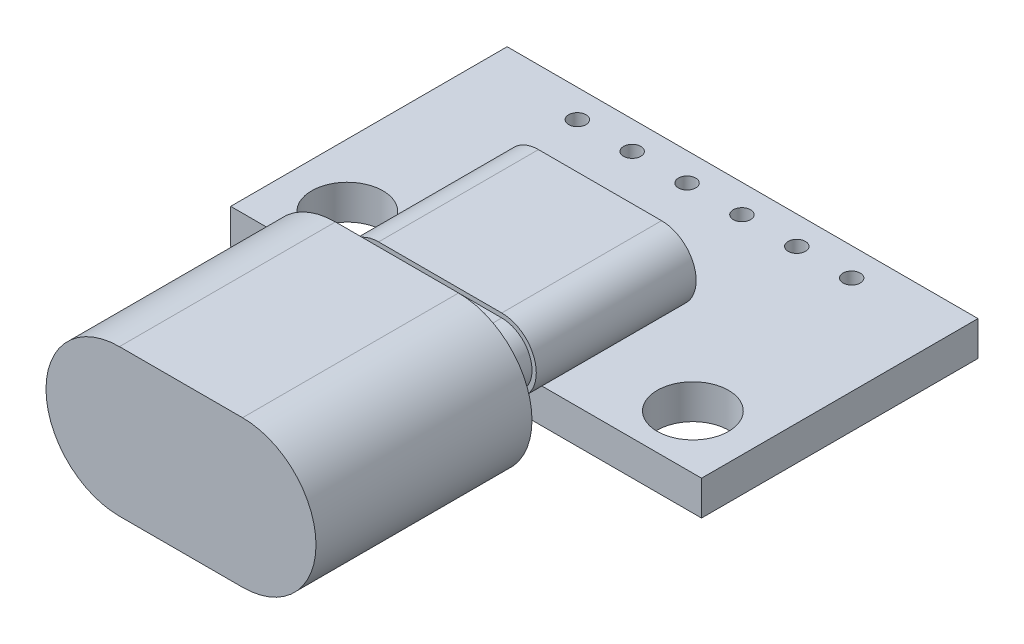
ISO-10303-21;
HEADER;
FILE_DESCRIPTION(('STEP AP214'),'2;1');
FILE_NAME('part.step','',(''),(''),'','','');
FILE_SCHEMA(('AUTOMOTIVE_DESIGN { 1 0 10303 214 1 1 1 1 }'));
ENDSEC;
DATA;
#1=APPLICATION_CONTEXT('core data for automotive mechanical design processes');
#2=APPLICATION_PROTOCOL_DEFINITION('international standard','automotive_design',2000,#1);
#3=PRODUCT_CONTEXT('',#1,'mechanical');
#4=PRODUCT('Part','Part','',(#3));
#5=PRODUCT_RELATED_PRODUCT_CATEGORY('part','',(#4));
#6=PRODUCT_DEFINITION_FORMATION('','',#4);
#7=PRODUCT_DEFINITION_CONTEXT('part definition',#1,'design');
#8=PRODUCT_DEFINITION('design','',#6,#7);
#9=PRODUCT_DEFINITION_SHAPE('','',#8);
#10=(LENGTH_UNIT() NAMED_UNIT(*) SI_UNIT(.MILLI.,.METRE.));
#11=(NAMED_UNIT(*) PLANE_ANGLE_UNIT() SI_UNIT($,.RADIAN.));
#12=(NAMED_UNIT(*) SI_UNIT($,.STERADIAN.) SOLID_ANGLE_UNIT());
#13=UNCERTAINTY_MEASURE_WITH_UNIT(LENGTH_MEASURE(1.E-05),#10,'distance_accuracy_value','');
#14=(GEOMETRIC_REPRESENTATION_CONTEXT(3) GLOBAL_UNCERTAINTY_ASSIGNED_CONTEXT((#13)) GLOBAL_UNIT_ASSIGNED_CONTEXT((#10,
#11,#12)) REPRESENTATION_CONTEXT('',''));
#15=CARTESIAN_POINT('',(0.,0.,0.));
#16=DIRECTION('',(0.,0.,1.));
#17=DIRECTION('',(1.,0.,0.));
#18=AXIS2_PLACEMENT_3D('',#15,#16,#17);
#19=CARTESIAN_POINT('',(-2.85,3.2,1.6));
#20=DIRECTION('',(0.,0.,1.));
#21=DIRECTION('',(1.,0.,0.));
#22=AXIS2_PLACEMENT_3D('',#19,#20,#21);
#23=PLANE('',#22);
#24=CARTESIAN_POINT('',(-2.85,3.2,1.6));
#25=DIRECTION('',(0.,0.,1.));
#26=DIRECTION('',(1.,0.,0.));
#27=AXIS2_PLACEMENT_3D('',#24,#25,#26);
#28=CIRCLE('',#27,1.3);
#29=CARTESIAN_POINT('',(-2.85,4.5,1.6));
#30=VERTEX_POINT('',#29);
#31=CARTESIAN_POINT('',(-2.85,1.9,1.6));
#32=VERTEX_POINT('',#31);
#33=EDGE_CURVE('E280',#30,#32,#28,.T.);
#34=ORIENTED_EDGE('',*,*,#33,.T.);
#35=DIRECTION('',(1.,0.,0.));
#36=VECTOR('',#35,1.);
#37=CARTESIAN_POINT('',(-2.85,1.9,1.6));
#38=LINE('',#37,#36);
#39=CARTESIAN_POINT('',(2.85,1.9,1.6));
#40=VERTEX_POINT('',#39);
#41=EDGE_CURVE('E278',#32,#40,#38,.T.);
#42=ORIENTED_EDGE('',*,*,#41,.T.);
#43=CARTESIAN_POINT('',(2.85,3.2,1.6));
#44=DIRECTION('',(0.,0.,1.));
#45=DIRECTION('',(1.,0.,0.));
#46=AXIS2_PLACEMENT_3D('',#43,#44,#45);
#47=CIRCLE('',#46,1.3);
#48=CARTESIAN_POINT('',(2.85,4.5,1.6));
#49=VERTEX_POINT('',#48);
#50=EDGE_CURVE('E283',#40,#49,#47,.T.);
#51=ORIENTED_EDGE('',*,*,#50,.T.);
#52=DIRECTION('',(-1.,0.,0.));
#53=VECTOR('',#52,1.);
#54=CARTESIAN_POINT('',(2.85,4.5,1.6));
#55=LINE('',#54,#53);
#56=EDGE_CURVE('E289',#49,#30,#55,.T.);
#57=ORIENTED_EDGE('',*,*,#56,.T.);
#58=EDGE_LOOP('',(#34,#42,#51,#57));
#59=FACE_BOUND('',#58,.T.);
#60=DIRECTION('',(-1.,0.,0.));
#61=VECTOR('',#60,1.);
#62=CARTESIAN_POINT('',(-2.9,3.55,1.6));
#63=LINE('',#62,#61);
#64=CARTESIAN_POINT('',(2.9,3.55,1.6));
#65=VERTEX_POINT('',#64);
#66=CARTESIAN_POINT('',(-2.9,3.55,1.6));
#67=VERTEX_POINT('',#66);
#68=EDGE_CURVE('E275',#65,#67,#63,.T.);
#69=ORIENTED_EDGE('',*,*,#68,.F.);
#70=DIRECTION('',(0.,1.,0.));
#71=VECTOR('',#70,1.);
#72=CARTESIAN_POINT('',(2.9,2.85,1.6));
#73=LINE('',#72,#71);
#74=CARTESIAN_POINT('',(2.9,2.85,1.6));
#75=VERTEX_POINT('',#74);
#76=EDGE_CURVE('E262',#75,#65,#73,.T.);
#77=ORIENTED_EDGE('',*,*,#76,.F.);
#78=DIRECTION('',(1.,0.,0.));
#79=VECTOR('',#78,1.);
#80=CARTESIAN_POINT('',(-2.9,2.85,1.6));
#81=LINE('',#80,#79);
#82=CARTESIAN_POINT('',(-2.9,2.85,1.6));
#83=VERTEX_POINT('',#82);
#84=EDGE_CURVE('E242',#83,#75,#81,.T.);
#85=ORIENTED_EDGE('',*,*,#84,.F.);
#86=DIRECTION('',(0.,-1.,0.));
#87=VECTOR('',#86,1.);
#88=CARTESIAN_POINT('',(-2.9,2.85,1.6));
#89=LINE('',#88,#87);
#90=EDGE_CURVE('E125',#67,#83,#89,.T.);
#91=ORIENTED_EDGE('',*,*,#90,.F.);
#92=EDGE_LOOP('',(#69,#77,#85,#91));
#93=FACE_BOUND('',#92,.T.);
#94=ADVANCED_FACE('F110',(#59,#93),#23,.T.);
#95=CARTESIAN_POINT('',(-2.85,1.6,7.6));
#96=DIRECTION('',(0.,0.,1.));
#97=DIRECTION('',(1.,0.,0.));
#98=AXIS2_PLACEMENT_3D('',#95,#96,#97);
#99=PLANE('',#98);
#100=CARTESIAN_POINT('',(-2.85,3.2,7.6));
#101=DIRECTION('',(0.,0.,1.));
#102=DIRECTION('',(1.,0.,0.));
#103=AXIS2_PLACEMENT_3D('',#100,#101,#102);
#104=CIRCLE('',#103,1.3);
#105=CARTESIAN_POINT('',(-2.85,4.5,7.6));
#106=VERTEX_POINT('',#105);
#107=CARTESIAN_POINT('',(-2.85,1.9,7.6));
#108=VERTEX_POINT('',#107);
#109=EDGE_CURVE('E135',#106,#108,#104,.T.);
#110=ORIENTED_EDGE('',*,*,#109,.F.);
#111=DIRECTION('',(-1.,0.,0.));
#112=VECTOR('',#111,1.);
#113=CARTESIAN_POINT('',(2.85,4.5,7.6));
#114=LINE('',#113,#112);
#115=CARTESIAN_POINT('',(2.85,4.5,7.6));
#116=VERTEX_POINT('',#115);
#117=EDGE_CURVE('E281',#116,#106,#114,.T.);
#118=ORIENTED_EDGE('',*,*,#117,.F.);
#119=CARTESIAN_POINT('',(2.85,3.2,7.6));
#120=DIRECTION('',(0.,0.,1.));
#121=DIRECTION('',(1.,0.,0.));
#122=AXIS2_PLACEMENT_3D('',#119,#120,#121);
#123=CIRCLE('',#122,1.3);
#124=CARTESIAN_POINT('',(2.85,1.9,7.6));
#125=VERTEX_POINT('',#124);
#126=EDGE_CURVE('E294',#125,#116,#123,.T.);
#127=ORIENTED_EDGE('',*,*,#126,.F.);
#128=DIRECTION('',(1.,0.,0.));
#129=VECTOR('',#128,1.);
#130=CARTESIAN_POINT('',(-2.85,1.9,7.6));
#131=LINE('',#130,#129);
#132=EDGE_CURVE('E259',#108,#125,#131,.T.);
#133=ORIENTED_EDGE('',*,*,#132,.F.);
#134=EDGE_LOOP('',(#110,#118,#127,#133));
#135=FACE_BOUND('',#134,.T.);
#136=CARTESIAN_POINT('',(-2.85,3.2,7.6));
#137=DIRECTION('',(0.,0.,1.));
#138=DIRECTION('',(1.,0.,0.));
#139=AXIS2_PLACEMENT_3D('',#136,#137,#138);
#140=CIRCLE('',#139,1.6);
#141=CARTESIAN_POINT('',(-2.85,4.8,7.6));
#142=VERTEX_POINT('',#141);
#143=CARTESIAN_POINT('',(-2.85,1.6,7.6));
#144=VERTEX_POINT('',#143);
#145=EDGE_CURVE('E14',#142,#144,#140,.T.);
#146=ORIENTED_EDGE('',*,*,#145,.T.);
#147=DIRECTION('',(1.,0.,0.));
#148=VECTOR('',#147,1.);
#149=CARTESIAN_POINT('',(-2.85,1.6,7.6));
#150=LINE('',#149,#148);
#151=CARTESIAN_POINT('',(2.85,1.6,7.6));
#152=VERTEX_POINT('',#151);
#153=EDGE_CURVE('E116',#144,#152,#150,.T.);
#154=ORIENTED_EDGE('',*,*,#153,.T.);
#155=CARTESIAN_POINT('',(2.85,3.2,7.6));
#156=DIRECTION('',(0.,0.,1.));
#157=DIRECTION('',(1.,0.,0.));
#158=AXIS2_PLACEMENT_3D('',#155,#156,#157);
#159=CIRCLE('',#158,1.6);
#160=CARTESIAN_POINT('',(2.85,4.8,7.6));
#161=VERTEX_POINT('',#160);
#162=EDGE_CURVE('E381',#152,#161,#159,.T.);
#163=ORIENTED_EDGE('',*,*,#162,.T.);
#164=DIRECTION('',(-1.,0.,0.));
#165=VECTOR('',#164,1.);
#166=CARTESIAN_POINT('',(-2.85,4.8,7.6));
#167=LINE('',#166,#165);
#168=EDGE_CURVE('E378',#161,#142,#167,.T.);
#169=ORIENTED_EDGE('',*,*,#168,.T.);
#170=EDGE_LOOP('',(#146,#154,#163,#169));
#171=FACE_BOUND('',#170,.T.);
#172=ADVANCED_FACE('F108',(#135,#171),#99,.T.);
#173=CARTESIAN_POINT('',(0.,1.6,0.));
#174=DIRECTION('',(0.,-1.,0.));
#175=DIRECTION('',(0.,0.,-1.));
#176=AXIS2_PLACEMENT_3D('',#173,#174,#175);
#177=PLANE('',#176);
#178=CARTESIAN_POINT('',(6.35,1.6,-5.1));
#179=DIRECTION('',(0.,1.,0.));
#180=DIRECTION('',(0.,0.,-1.));
#181=AXIS2_PLACEMENT_3D('',#178,#179,#180);
#182=CIRCLE('',#181,0.4);
#183=CARTESIAN_POINT('',(6.35,1.6,-5.5));
#184=VERTEX_POINT('',#183);
#185=EDGE_CURVE('E747',#184,#184,#182,.T.);
#186=ORIENTED_EDGE('',*,*,#185,.F.);
#187=EDGE_LOOP('',(#186));
#188=FACE_BOUND('',#187,.T.);
#189=CARTESIAN_POINT('',(3.81,1.6,-5.1));
#190=DIRECTION('',(0.,1.,0.));
#191=DIRECTION('',(0.,0.,-1.));
#192=AXIS2_PLACEMENT_3D('',#189,#190,#191);
#193=CIRCLE('',#192,0.4);
#194=CARTESIAN_POINT('',(3.81,1.6,-5.5));
#195=VERTEX_POINT('',#194);
#196=EDGE_CURVE('E741',#195,#195,#193,.T.);
#197=ORIENTED_EDGE('',*,*,#196,.F.);
#198=EDGE_LOOP('',(#197));
#199=FACE_BOUND('',#198,.T.);
#200=CARTESIAN_POINT('',(1.27,1.6,-5.1));
#201=DIRECTION('',(0.,1.,0.));
#202=DIRECTION('',(0.,0.,-1.));
#203=AXIS2_PLACEMENT_3D('',#200,#201,#202);
#204=CIRCLE('',#203,0.4);
#205=CARTESIAN_POINT('',(1.27,1.6,-5.5));
#206=VERTEX_POINT('',#205);
#207=EDGE_CURVE('E748',#206,#206,#204,.T.);
#208=ORIENTED_EDGE('',*,*,#207,.F.);
#209=EDGE_LOOP('',(#208));
#210=FACE_BOUND('',#209,.T.);
#211=CARTESIAN_POINT('',(-6.35,1.6,-5.1));
#212=DIRECTION('',(0.,1.,0.));
#213=DIRECTION('',(0.,0.,1.));
#214=AXIS2_PLACEMENT_3D('',#211,#212,#213);
#215=CIRCLE('',#214,0.4);
#216=CARTESIAN_POINT('',(-6.35,1.6,-4.7));
#217=VERTEX_POINT('',#216);
#218=EDGE_CURVE('E753',#217,#217,#215,.T.);
#219=ORIENTED_EDGE('',*,*,#218,.F.);
#220=EDGE_LOOP('',(#219));
#221=FACE_BOUND('',#220,.T.);
#222=CARTESIAN_POINT('',(-3.81,1.6,-5.1));
#223=DIRECTION('',(0.,1.,0.));
#224=DIRECTION('',(0.,0.,1.));
#225=AXIS2_PLACEMENT_3D('',#222,#223,#224);
#226=CIRCLE('',#225,0.4);
#227=CARTESIAN_POINT('',(-3.81,1.6,-4.7));
#228=VERTEX_POINT('',#227);
#229=EDGE_CURVE('E759',#228,#228,#226,.T.);
#230=ORIENTED_EDGE('',*,*,#229,.F.);
#231=EDGE_LOOP('',(#230));
#232=FACE_BOUND('',#231,.T.);
#233=CARTESIAN_POINT('',(-1.27,1.6,-5.1));
#234=DIRECTION('',(0.,1.,0.));
#235=DIRECTION('',(0.,0.,1.));
#236=AXIS2_PLACEMENT_3D('',#233,#234,#235);
#237=CIRCLE('',#236,0.4);
#238=CARTESIAN_POINT('',(-1.27,1.6,-4.7));
#239=VERTEX_POINT('',#238);
#240=EDGE_CURVE('E404',#239,#239,#237,.T.);
#241=ORIENTED_EDGE('',*,*,#240,.F.);
#242=EDGE_LOOP('',(#241));
#243=FACE_BOUND('',#242,.T.);
#244=CARTESIAN_POINT('',(8.,1.6,3.9));
#245=DIRECTION('',(0.,1.,0.));
#246=DIRECTION('',(0.,0.,1.));
#247=AXIS2_PLACEMENT_3D('',#244,#245,#246);
#248=CIRCLE('',#247,1.65);
#249=CARTESIAN_POINT('',(8.,1.6,5.55));
#250=VERTEX_POINT('',#249);
#251=EDGE_CURVE('E355',#250,#250,#248,.T.);
#252=ORIENTED_EDGE('',*,*,#251,.F.);
#253=EDGE_LOOP('',(#252));
#254=FACE_BOUND('',#253,.T.);
#255=CARTESIAN_POINT('',(-8.,1.6,3.9));
#256=DIRECTION('',(0.,1.,0.));
#257=DIRECTION('',(0.,0.,1.));
#258=AXIS2_PLACEMENT_3D('',#255,#256,#257);
#259=CIRCLE('',#258,1.65);
#260=CARTESIAN_POINT('',(-8.,1.6,5.55));
#261=VERTEX_POINT('',#260);
#262=EDGE_CURVE('E360',#261,#261,#259,.T.);
#263=ORIENTED_EDGE('',*,*,#262,.F.);
#264=EDGE_LOOP('',(#263));
#265=FACE_BOUND('',#264,.T.);
#266=DIRECTION('',(0.,0.,1.));
#267=VECTOR('',#266,1.);
#268=CARTESIAN_POINT('',(-2.85,1.6,0.2));
#269=LINE('',#268,#267);
#270=CARTESIAN_POINT('',(-2.85,1.6,0.2));
#271=VERTEX_POINT('',#270);
#272=CARTESIAN_POINT('',(-2.85,1.6,6.4));
#273=VERTEX_POINT('',#272);
#274=EDGE_CURVE('E368',#271,#273,#269,.T.);
#275=ORIENTED_EDGE('',*,*,#274,.F.);
#276=DIRECTION('',(1.,0.,0.));
#277=VECTOR('',#276,1.);
#278=CARTESIAN_POINT('',(-2.85,1.6,0.2));
#279=LINE('',#278,#277);
#280=CARTESIAN_POINT('',(2.85,1.6,0.2));
#281=VERTEX_POINT('',#280);
#282=EDGE_CURVE('E394',#271,#281,#279,.T.);
#283=ORIENTED_EDGE('',*,*,#282,.T.);
#284=DIRECTION('',(0.,0.,1.));
#285=VECTOR('',#284,1.);
#286=CARTESIAN_POINT('',(2.85,1.6,0.2));
#287=LINE('',#286,#285);
#288=CARTESIAN_POINT('',(2.85,1.6,6.4));
#289=VERTEX_POINT('',#288);
#290=EDGE_CURVE('E371',#281,#289,#287,.T.);
#291=ORIENTED_EDGE('',*,*,#290,.T.);
#292=DIRECTION('',(1.,0.,0.));
#293=VECTOR('',#292,1.);
#294=CARTESIAN_POINT('',(-10.9,1.6,6.4));
#295=LINE('',#294,#293);
#296=CARTESIAN_POINT('',(10.9,1.6,6.4));
#297=VERTEX_POINT('',#296);
#298=EDGE_CURVE('E344',#289,#297,#295,.T.);
#299=ORIENTED_EDGE('',*,*,#298,.T.);
#300=DIRECTION('',(0.,0.,-1.));
#301=VECTOR('',#300,1.);
#302=CARTESIAN_POINT('',(10.9,1.6,6.4));
#303=LINE('',#302,#301);
#304=CARTESIAN_POINT('',(10.9,1.6,-6.4));
#305=VERTEX_POINT('',#304);
#306=EDGE_CURVE('E327',#297,#305,#303,.T.);
#307=ORIENTED_EDGE('',*,*,#306,.T.);
#308=DIRECTION('',(-1.,0.,0.));
#309=VECTOR('',#308,1.);
#310=CARTESIAN_POINT('',(-10.9,1.6,-6.4));
#311=LINE('',#310,#309);
#312=CARTESIAN_POINT('',(-10.9,1.6,-6.4));
#313=VERTEX_POINT('',#312);
#314=EDGE_CURVE('E347',#305,#313,#311,.T.);
#315=ORIENTED_EDGE('',*,*,#314,.T.);
#316=DIRECTION('',(0.,0.,1.));
#317=VECTOR('',#316,1.);
#318=CARTESIAN_POINT('',(-10.9,1.6,6.4));
#319=LINE('',#318,#317);
#320=CARTESIAN_POINT('',(-10.9,1.6,6.4));
#321=VERTEX_POINT('',#320);
#322=EDGE_CURVE('E342',#313,#321,#319,.T.);
#323=ORIENTED_EDGE('',*,*,#322,.T.);
#324=EDGE_CURVE('E323',#321,#273,#295,.T.);
#325=ORIENTED_EDGE('',*,*,#324,.T.);
#326=EDGE_LOOP('',(#275,#283,#291,#299,#307,#315,#323,#325));
#327=FACE_BOUND('',#326,.T.);
#328=ADVANCED_FACE('F468',(#188,#199,#210,#221,#232,#243,#254,#265,#327),#177,.F.);
#329=CARTESIAN_POINT('',(10.9,1.6,6.4));
#330=DIRECTION('',(-1.,0.,0.));
#331=DIRECTION('',(0.,0.,1.));
#332=AXIS2_PLACEMENT_3D('',#329,#330,#331);
#333=PLANE('',#332);
#334=DIRECTION('',(0.,0.,-1.));
#335=VECTOR('',#334,1.);
#336=CARTESIAN_POINT('',(10.9,0.,6.4));
#337=LINE('',#336,#335);
#338=CARTESIAN_POINT('',(10.9,0.,6.4));
#339=VERTEX_POINT('',#338);
#340=CARTESIAN_POINT('',(10.9,0.,-6.4));
#341=VERTEX_POINT('',#340);
#342=EDGE_CURVE('E331',#339,#341,#337,.T.);
#343=ORIENTED_EDGE('',*,*,#342,.T.);
#344=DIRECTION('',(0.,-1.,0.));
#345=VECTOR('',#344,1.);
#346=CARTESIAN_POINT('',(10.9,1.6,-6.4));
#347=LINE('',#346,#345);
#348=EDGE_CURVE('E304',#305,#341,#347,.T.);
#349=ORIENTED_EDGE('',*,*,#348,.F.);
#350=ORIENTED_EDGE('',*,*,#306,.F.);
#351=DIRECTION('',(0.,-1.,0.));
#352=VECTOR('',#351,1.);
#353=CARTESIAN_POINT('',(10.9,1.6,6.4));
#354=LINE('',#353,#352);
#355=EDGE_CURVE('E319',#297,#339,#354,.T.);
#356=ORIENTED_EDGE('',*,*,#355,.T.);
#357=EDGE_LOOP('',(#343,#349,#350,#356));
#358=FACE_BOUND('',#357,.T.);
#359=ADVANCED_FACE('F453',(#358),#333,.F.);
#360=CARTESIAN_POINT('',(-10.9,1.6,-6.4));
#361=DIRECTION('',(0.,0.,1.));
#362=DIRECTION('',(1.,0.,0.));
#363=AXIS2_PLACEMENT_3D('',#360,#361,#362);
#364=PLANE('',#363);
#365=DIRECTION('',(-1.,0.,0.));
#366=VECTOR('',#365,1.);
#367=CARTESIAN_POINT('',(-10.9,0.,-6.4));
#368=LINE('',#367,#366);
#369=CARTESIAN_POINT('',(-10.9,0.,-6.4));
#370=VERTEX_POINT('',#369);
#371=EDGE_CURVE('E332',#341,#370,#368,.T.);
#372=ORIENTED_EDGE('',*,*,#371,.T.);
#373=DIRECTION('',(0.,-1.,0.));
#374=VECTOR('',#373,1.);
#375=CARTESIAN_POINT('',(-10.9,1.6,-6.4));
#376=LINE('',#375,#374);
#377=EDGE_CURVE('E311',#313,#370,#376,.T.);
#378=ORIENTED_EDGE('',*,*,#377,.F.);
#379=ORIENTED_EDGE('',*,*,#314,.F.);
#380=ORIENTED_EDGE('',*,*,#348,.T.);
#381=EDGE_LOOP('',(#372,#378,#379,#380));
#382=FACE_BOUND('',#381,.T.);
#383=ADVANCED_FACE('F463',(#382),#364,.F.);
#384=CARTESIAN_POINT('',(-10.9,1.6,6.4));
#385=DIRECTION('',(1.,0.,0.));
#386=DIRECTION('',(0.,0.,-1.));
#387=AXIS2_PLACEMENT_3D('',#384,#385,#386);
#388=PLANE('',#387);
#389=DIRECTION('',(0.,0.,1.));
#390=VECTOR('',#389,1.);
#391=CARTESIAN_POINT('',(-10.9,0.,6.4));
#392=LINE('',#391,#390);
#393=CARTESIAN_POINT('',(-10.9,0.,6.4));
#394=VERTEX_POINT('',#393);
#395=EDGE_CURVE('E330',#370,#394,#392,.T.);
#396=ORIENTED_EDGE('',*,*,#395,.T.);
#397=DIRECTION('',(0.,-1.,0.));
#398=VECTOR('',#397,1.);
#399=CARTESIAN_POINT('',(-10.9,1.6,6.4));
#400=LINE('',#399,#398);
#401=EDGE_CURVE('E320',#321,#394,#400,.T.);
#402=ORIENTED_EDGE('',*,*,#401,.F.);
#403=ORIENTED_EDGE('',*,*,#322,.F.);
#404=ORIENTED_EDGE('',*,*,#377,.T.);
#405=EDGE_LOOP('',(#396,#402,#403,#404));
#406=FACE_BOUND('',#405,.T.);
#407=ADVANCED_FACE('F461',(#406),#388,.F.);
#408=CARTESIAN_POINT('',(-10.9,1.6,6.4));
#409=DIRECTION('',(0.,0.,-1.));
#410=DIRECTION('',(-1.,0.,0.));
#411=AXIS2_PLACEMENT_3D('',#408,#409,#410);
#412=PLANE('',#411);
#413=DIRECTION('',(1.,0.,0.));
#414=VECTOR('',#413,1.);
#415=CARTESIAN_POINT('',(-10.9,0.,6.4));
#416=LINE('',#415,#414);
#417=EDGE_CURVE('E322',#394,#339,#416,.T.);
#418=ORIENTED_EDGE('',*,*,#417,.T.);
#419=ORIENTED_EDGE('',*,*,#355,.F.);
#420=ORIENTED_EDGE('',*,*,#298,.F.);
#421=EDGE_CURVE('E343',#273,#289,#295,.T.);
#422=ORIENTED_EDGE('',*,*,#421,.F.);
#423=ORIENTED_EDGE('',*,*,#324,.F.);
#424=ORIENTED_EDGE('',*,*,#401,.T.);
#425=EDGE_LOOP('',(#418,#419,#420,#422,#423,#424));
#426=FACE_BOUND('',#425,.T.);
#427=ADVANCED_FACE('F431',(#426),#412,.F.);
#428=CARTESIAN_POINT('',(0.,0.,0.));
#429=DIRECTION('',(0.,-1.,0.));
#430=DIRECTION('',(0.,0.,-1.));
#431=AXIS2_PLACEMENT_3D('',#428,#429,#430);
#432=PLANE('',#431);
#433=CARTESIAN_POINT('',(6.35,0.,-5.1));
#434=DIRECTION('',(0.,-1.,0.));
#435=DIRECTION('',(0.,0.,-1.));
#436=AXIS2_PLACEMENT_3D('',#433,#434,#435);
#437=CIRCLE('',#436,0.4);
#438=CARTESIAN_POINT('',(6.35,0.,-5.5));
#439=VERTEX_POINT('',#438);
#440=EDGE_CURVE('E112',#439,#439,#437,.T.);
#441=ORIENTED_EDGE('',*,*,#440,.F.);
#442=EDGE_LOOP('',(#441));
#443=FACE_BOUND('',#442,.T.);
#444=CARTESIAN_POINT('',(3.81,0.,-5.1));
#445=DIRECTION('',(0.,-1.,0.));
#446=DIRECTION('',(0.,0.,-1.));
#447=AXIS2_PLACEMENT_3D('',#444,#445,#446);
#448=CIRCLE('',#447,0.4);
#449=CARTESIAN_POINT('',(3.81,0.,-5.5));
#450=VERTEX_POINT('',#449);
#451=EDGE_CURVE('E412',#450,#450,#448,.T.);
#452=ORIENTED_EDGE('',*,*,#451,.F.);
#453=EDGE_LOOP('',(#452));
#454=FACE_BOUND('',#453,.T.);
#455=CARTESIAN_POINT('',(1.27,0.,-5.1));
#456=DIRECTION('',(0.,-1.,0.));
#457=DIRECTION('',(0.,0.,-1.));
#458=AXIS2_PLACEMENT_3D('',#455,#456,#457);
#459=CIRCLE('',#458,0.4);
#460=CARTESIAN_POINT('',(1.27,0.,-5.5));
#461=VERTEX_POINT('',#460);
#462=EDGE_CURVE('E409',#461,#461,#459,.T.);
#463=ORIENTED_EDGE('',*,*,#462,.F.);
#464=EDGE_LOOP('',(#463));
#465=FACE_BOUND('',#464,.T.);
#466=CARTESIAN_POINT('',(-6.35,0.,-5.1));
#467=DIRECTION('',(0.,-1.,0.));
#468=DIRECTION('',(0.,0.,-1.));
#469=AXIS2_PLACEMENT_3D('',#466,#467,#468);
#470=CIRCLE('',#469,0.4);
#471=CARTESIAN_POINT('',(-6.35,0.,-5.5));
#472=VERTEX_POINT('',#471);
#473=EDGE_CURVE('E410',#472,#472,#470,.T.);
#474=ORIENTED_EDGE('',*,*,#473,.F.);
#475=EDGE_LOOP('',(#474));
#476=FACE_BOUND('',#475,.T.);
#477=CARTESIAN_POINT('',(-3.81,0.,-5.1));
#478=DIRECTION('',(0.,-1.,0.));
#479=DIRECTION('',(0.,0.,-1.));
#480=AXIS2_PLACEMENT_3D('',#477,#478,#479);
#481=CIRCLE('',#480,0.4);
#482=CARTESIAN_POINT('',(-3.81,0.,-5.5));
#483=VERTEX_POINT('',#482);
#484=EDGE_CURVE('E401',#483,#483,#481,.T.);
#485=ORIENTED_EDGE('',*,*,#484,.F.);
#486=EDGE_LOOP('',(#485));
#487=FACE_BOUND('',#486,.T.);
#488=CARTESIAN_POINT('',(-1.27,0.,-5.1));
#489=DIRECTION('',(0.,-1.,0.));
#490=DIRECTION('',(0.,0.,-1.));
#491=AXIS2_PLACEMENT_3D('',#488,#489,#490);
#492=CIRCLE('',#491,0.4);
#493=CARTESIAN_POINT('',(-1.27,0.,-5.5));
#494=VERTEX_POINT('',#493);
#495=EDGE_CURVE('E400',#494,#494,#492,.T.);
#496=ORIENTED_EDGE('',*,*,#495,.F.);
#497=EDGE_LOOP('',(#496));
#498=FACE_BOUND('',#497,.T.);
#499=CARTESIAN_POINT('',(-8.,0.,3.9));
#500=DIRECTION('',(0.,1.,0.));
#501=DIRECTION('',(0.,0.,1.));
#502=AXIS2_PLACEMENT_3D('',#499,#500,#501);
#503=CIRCLE('',#502,1.65);
#504=CARTESIAN_POINT('',(-8.,0.,5.55));
#505=VERTEX_POINT('',#504);
#506=EDGE_CURVE('E337',#505,#505,#503,.T.);
#507=ORIENTED_EDGE('',*,*,#506,.T.);
#508=EDGE_LOOP('',(#507));
#509=FACE_BOUND('',#508,.T.);
#510=CARTESIAN_POINT('',(8.,0.,3.9));
#511=DIRECTION('',(0.,1.,0.));
#512=DIRECTION('',(0.,0.,1.));
#513=AXIS2_PLACEMENT_3D('',#510,#511,#512);
#514=CIRCLE('',#513,1.65);
#515=CARTESIAN_POINT('',(8.,0.,5.55));
#516=VERTEX_POINT('',#515);
#517=EDGE_CURVE('E358',#516,#516,#514,.T.);
#518=ORIENTED_EDGE('',*,*,#517,.T.);
#519=EDGE_LOOP('',(#518));
#520=FACE_BOUND('',#519,.T.);
#521=ORIENTED_EDGE('',*,*,#342,.F.);
#522=ORIENTED_EDGE('',*,*,#417,.F.);
#523=ORIENTED_EDGE('',*,*,#395,.F.);
#524=ORIENTED_EDGE('',*,*,#371,.F.);
#525=EDGE_LOOP('',(#521,#522,#523,#524));
#526=FACE_BOUND('',#525,.T.);
#527=ADVANCED_FACE('F430',(#443,#454,#465,#476,#487,#498,#509,#520,#526),#432,.T.);
#528=CARTESIAN_POINT('',(8.,0.,3.9));
#529=DIRECTION('',(0.,1.,0.));
#530=DIRECTION('',(0.,0.,1.));
#531=AXIS2_PLACEMENT_3D('',#528,#529,#530);
#532=CYLINDRICAL_SURFACE('',#531,1.65);
#533=ORIENTED_EDGE('',*,*,#517,.F.);
#534=EDGE_LOOP('',(#533));
#535=FACE_BOUND('',#534,.T.);
#536=ORIENTED_EDGE('',*,*,#251,.T.);
#537=EDGE_LOOP('',(#536));
#538=FACE_BOUND('',#537,.T.);
#539=ADVANCED_FACE('F429',(#535,#538),#532,.F.);
#540=CARTESIAN_POINT('',(-8.,0.,3.9));
#541=DIRECTION('',(0.,1.,0.));
#542=DIRECTION('',(0.,0.,1.));
#543=AXIS2_PLACEMENT_3D('',#540,#541,#542);
#544=CYLINDRICAL_SURFACE('',#543,1.65);
#545=ORIENTED_EDGE('',*,*,#506,.F.);
#546=EDGE_LOOP('',(#545));
#547=FACE_BOUND('',#546,.T.);
#548=ORIENTED_EDGE('',*,*,#262,.T.);
#549=EDGE_LOOP('',(#548));
#550=FACE_BOUND('',#549,.T.);
#551=ADVANCED_FACE('F527',(#547,#550),#544,.F.);
#552=CARTESIAN_POINT('',(-2.85,1.6,0.2));
#553=DIRECTION('',(0.,-1.,0.));
#554=DIRECTION('',(1.,0.,0.));
#555=AXIS2_PLACEMENT_3D('',#552,#553,#554);
#556=PLANE('',#555);
#557=ORIENTED_EDGE('',*,*,#421,.T.);
#558=EDGE_CURVE('E367',#289,#152,#287,.T.);
#559=ORIENTED_EDGE('',*,*,#558,.T.);
#560=ORIENTED_EDGE('',*,*,#153,.F.);
#561=EDGE_CURVE('E369',#273,#144,#269,.T.);
#562=ORIENTED_EDGE('',*,*,#561,.F.);
#563=EDGE_LOOP('',(#557,#559,#560,#562));
#564=FACE_BOUND('',#563,.T.);
#565=ADVANCED_FACE('F471',(#564),#556,.T.);
#566=CARTESIAN_POINT('',(-2.85,3.2,0.2));
#567=DIRECTION('',(0.,0.,1.));
#568=DIRECTION('',(1.,0.,0.));
#569=AXIS2_PLACEMENT_3D('',#566,#567,#568);
#570=CYLINDRICAL_SURFACE('',#569,1.6);
#571=ORIENTED_EDGE('',*,*,#145,.F.);
#572=DIRECTION('',(0.,0.,1.));
#573=VECTOR('',#572,1.);
#574=CARTESIAN_POINT('',(-2.85,4.8,0.2));
#575=LINE('',#574,#573);
#576=CARTESIAN_POINT('',(-2.85,4.8,0.2));
#577=VERTEX_POINT('',#576);
#578=EDGE_CURVE('E354',#577,#142,#575,.T.);
#579=ORIENTED_EDGE('',*,*,#578,.F.);
#580=CARTESIAN_POINT('',(-2.85,3.2,0.2));
#581=DIRECTION('',(0.,0.,1.));
#582=DIRECTION('',(1.,0.,0.));
#583=AXIS2_PLACEMENT_3D('',#580,#581,#582);
#584=CIRCLE('',#583,1.6);
#585=EDGE_CURVE('E385',#577,#271,#584,.T.);
#586=ORIENTED_EDGE('',*,*,#585,.T.);
#587=ORIENTED_EDGE('',*,*,#274,.T.);
#588=ORIENTED_EDGE('',*,*,#561,.T.);
#589=EDGE_LOOP('',(#571,#579,#586,#587,#588));
#590=FACE_BOUND('',#589,.T.);
#591=ADVANCED_FACE('F482',(#590),#570,.T.);
#592=CARTESIAN_POINT('',(-2.85,4.8,0.2));
#593=DIRECTION('',(0.,1.,0.));
#594=DIRECTION('',(-1.,0.,0.));
#595=AXIS2_PLACEMENT_3D('',#592,#593,#594);
#596=PLANE('',#595);
#597=ORIENTED_EDGE('',*,*,#168,.F.);
#598=DIRECTION('',(0.,0.,1.));
#599=VECTOR('',#598,1.);
#600=CARTESIAN_POINT('',(2.85,4.8,0.2));
#601=LINE('',#600,#599);
#602=CARTESIAN_POINT('',(2.85,4.8,0.2));
#603=VERTEX_POINT('',#602);
#604=EDGE_CURVE('E372',#603,#161,#601,.T.);
#605=ORIENTED_EDGE('',*,*,#604,.F.);
#606=DIRECTION('',(-1.,0.,0.));
#607=VECTOR('',#606,1.);
#608=CARTESIAN_POINT('',(-2.85,4.8,0.2));
#609=LINE('',#608,#607);
#610=EDGE_CURVE('E386',#603,#577,#609,.T.);
#611=ORIENTED_EDGE('',*,*,#610,.T.);
#612=ORIENTED_EDGE('',*,*,#578,.T.);
#613=EDGE_LOOP('',(#597,#605,#611,#612));
#614=FACE_BOUND('',#613,.T.);
#615=ADVANCED_FACE('F491',(#614),#596,.T.);
#616=CARTESIAN_POINT('',(2.85,3.2,0.2));
#617=DIRECTION('',(0.,0.,1.));
#618=DIRECTION('',(1.,0.,0.));
#619=AXIS2_PLACEMENT_3D('',#616,#617,#618);
#620=CYLINDRICAL_SURFACE('',#619,1.6);
#621=ORIENTED_EDGE('',*,*,#162,.F.);
#622=ORIENTED_EDGE('',*,*,#558,.F.);
#623=ORIENTED_EDGE('',*,*,#290,.F.);
#624=CARTESIAN_POINT('',(2.85,3.2,0.2));
#625=DIRECTION('',(0.,0.,1.));
#626=DIRECTION('',(1.,0.,0.));
#627=AXIS2_PLACEMENT_3D('',#624,#625,#626);
#628=CIRCLE('',#627,1.6);
#629=EDGE_CURVE('E395',#281,#603,#628,.T.);
#630=ORIENTED_EDGE('',*,*,#629,.T.);
#631=ORIENTED_EDGE('',*,*,#604,.T.);
#632=EDGE_LOOP('',(#621,#622,#623,#630,#631));
#633=FACE_BOUND('',#632,.T.);
#634=ADVANCED_FACE('F480',(#633),#620,.T.);
#635=CARTESIAN_POINT('',(-2.85,3.2,0.2));
#636=DIRECTION('',(0.,0.,1.));
#637=DIRECTION('',(1.,0.,0.));
#638=AXIS2_PLACEMENT_3D('',#635,#636,#637);
#639=PLANE('',#638);
#640=ORIENTED_EDGE('',*,*,#585,.F.);
#641=ORIENTED_EDGE('',*,*,#610,.F.);
#642=ORIENTED_EDGE('',*,*,#629,.F.);
#643=ORIENTED_EDGE('',*,*,#282,.F.);
#644=EDGE_LOOP('',(#640,#641,#642,#643));
#645=FACE_BOUND('',#644,.T.);
#646=ADVANCED_FACE('F488',(#645),#639,.F.);
#647=CARTESIAN_POINT('',(-2.85,3.2,1.6));
#648=DIRECTION('',(0.,0.,1.));
#649=DIRECTION('',(1.,0.,0.));
#650=AXIS2_PLACEMENT_3D('',#647,#648,#649);
#651=CYLINDRICAL_SURFACE('',#650,1.3);
#652=ORIENTED_EDGE('',*,*,#109,.T.);
#653=DIRECTION('',(0.,0.,1.));
#654=VECTOR('',#653,1.);
#655=CARTESIAN_POINT('',(-2.85,1.9,1.6));
#656=LINE('',#655,#654);
#657=EDGE_CURVE('E290',#32,#108,#656,.T.);
#658=ORIENTED_EDGE('',*,*,#657,.F.);
#659=ORIENTED_EDGE('',*,*,#33,.F.);
#660=DIRECTION('',(0.,0.,1.));
#661=VECTOR('',#660,1.);
#662=CARTESIAN_POINT('',(-2.85,4.5,1.6));
#663=LINE('',#662,#661);
#664=EDGE_CURVE('E299',#30,#106,#663,.T.);
#665=ORIENTED_EDGE('',*,*,#664,.T.);
#666=EDGE_LOOP('',(#652,#658,#659,#665));
#667=FACE_BOUND('',#666,.T.);
#668=ADVANCED_FACE('F506',(#667),#651,.F.);
#669=CARTESIAN_POINT('',(2.85,4.5,1.6));
#670=DIRECTION('',(0.,1.,0.));
#671=DIRECTION('',(0.,0.,1.));
#672=AXIS2_PLACEMENT_3D('',#669,#670,#671);
#673=PLANE('',#672);
#674=ORIENTED_EDGE('',*,*,#117,.T.);
#675=ORIENTED_EDGE('',*,*,#664,.F.);
#676=ORIENTED_EDGE('',*,*,#56,.F.);
#677=DIRECTION('',(0.,0.,1.));
#678=VECTOR('',#677,1.);
#679=CARTESIAN_POINT('',(2.85,4.5,1.6));
#680=LINE('',#679,#678);
#681=EDGE_CURVE('E302',#49,#116,#680,.T.);
#682=ORIENTED_EDGE('',*,*,#681,.T.);
#683=EDGE_LOOP('',(#674,#675,#676,#682));
#684=FACE_BOUND('',#683,.T.);
#685=ADVANCED_FACE('F558',(#684),#673,.F.);
#686=CARTESIAN_POINT('',(2.85,3.2,1.6));
#687=DIRECTION('',(0.,0.,1.));
#688=DIRECTION('',(1.,0.,0.));
#689=AXIS2_PLACEMENT_3D('',#686,#687,#688);
#690=CYLINDRICAL_SURFACE('',#689,1.3);
#691=ORIENTED_EDGE('',*,*,#126,.T.);
#692=ORIENTED_EDGE('',*,*,#681,.F.);
#693=ORIENTED_EDGE('',*,*,#50,.F.);
#694=DIRECTION('',(0.,0.,1.));
#695=VECTOR('',#694,1.);
#696=CARTESIAN_POINT('',(2.85,1.9,1.6));
#697=LINE('',#696,#695);
#698=EDGE_CURVE('E308',#40,#125,#697,.T.);
#699=ORIENTED_EDGE('',*,*,#698,.T.);
#700=EDGE_LOOP('',(#691,#692,#693,#699));
#701=FACE_BOUND('',#700,.T.);
#702=ADVANCED_FACE('F539',(#701),#690,.F.);
#703=CARTESIAN_POINT('',(-2.85,1.9,1.6));
#704=DIRECTION('',(0.,-1.,0.));
#705=DIRECTION('',(0.,0.,-1.));
#706=AXIS2_PLACEMENT_3D('',#703,#704,#705);
#707=PLANE('',#706);
#708=ORIENTED_EDGE('',*,*,#132,.T.);
#709=ORIENTED_EDGE('',*,*,#698,.F.);
#710=ORIENTED_EDGE('',*,*,#41,.F.);
#711=ORIENTED_EDGE('',*,*,#657,.T.);
#712=EDGE_LOOP('',(#708,#709,#710,#711));
#713=FACE_BOUND('',#712,.T.);
#714=ADVANCED_FACE('F540',(#713),#707,.F.);
#715=CARTESIAN_POINT('',(2.9,2.85,13.4420886675914));
#716=DIRECTION('',(-1.,0.,0.));
#717=DIRECTION('',(0.,0.,1.));
#718=AXIS2_PLACEMENT_3D('',#715,#716,#717);
#719=PLANE('',#718);
#720=DIRECTION('',(0.,1.,0.));
#721=VECTOR('',#720,1.);
#722=CARTESIAN_POINT('',(2.9,2.85,6.6));
#723=LINE('',#722,#721);
#724=CARTESIAN_POINT('',(2.9,2.85,6.6));
#725=VERTEX_POINT('',#724);
#726=CARTESIAN_POINT('',(2.9,3.55,6.6));
#727=VERTEX_POINT('',#726);
#728=EDGE_CURVE('E251',#725,#727,#723,.T.);
#729=ORIENTED_EDGE('',*,*,#728,.F.);
#730=DIRECTION('',(0.,0.,-1.));
#731=VECTOR('',#730,1.);
#732=CARTESIAN_POINT('',(2.9,2.85,13.4420886675914));
#733=LINE('',#732,#731);
#734=EDGE_CURVE('E247',#725,#75,#733,.T.);
#735=ORIENTED_EDGE('',*,*,#734,.T.);
#736=ORIENTED_EDGE('',*,*,#76,.T.);
#737=DIRECTION('',(0.,0.,-1.));
#738=VECTOR('',#737,1.);
#739=CARTESIAN_POINT('',(2.9,3.55,13.4420886675914));
#740=LINE('',#739,#738);
#741=EDGE_CURVE('E267',#727,#65,#740,.T.);
#742=ORIENTED_EDGE('',*,*,#741,.F.);
#743=EDGE_LOOP('',(#729,#735,#736,#742));
#744=FACE_BOUND('',#743,.T.);
#745=ADVANCED_FACE('F537',(#744),#719,.F.);
#746=CARTESIAN_POINT('',(-2.9,3.55,13.4420886675914));
#747=DIRECTION('',(0.,-1.,0.));
#748=DIRECTION('',(0.,0.,-1.));
#749=AXIS2_PLACEMENT_3D('',#746,#747,#748);
#750=PLANE('',#749);
#751=DIRECTION('',(-1.,0.,0.));
#752=VECTOR('',#751,1.);
#753=CARTESIAN_POINT('',(-2.9,3.55,6.6));
#754=LINE('',#753,#752);
#755=CARTESIAN_POINT('',(-2.9,3.55,6.6));
#756=VERTEX_POINT('',#755);
#757=EDGE_CURVE('E260',#727,#756,#754,.T.);
#758=ORIENTED_EDGE('',*,*,#757,.F.);
#759=ORIENTED_EDGE('',*,*,#741,.T.);
#760=ORIENTED_EDGE('',*,*,#68,.T.);
#761=DIRECTION('',(0.,0.,-1.));
#762=VECTOR('',#761,1.);
#763=CARTESIAN_POINT('',(-2.9,3.55,13.4420886675914));
#764=LINE('',#763,#762);
#765=EDGE_CURVE('E272',#756,#67,#764,.T.);
#766=ORIENTED_EDGE('',*,*,#765,.F.);
#767=EDGE_LOOP('',(#758,#759,#760,#766));
#768=FACE_BOUND('',#767,.T.);
#769=ADVANCED_FACE('F554',(#768),#750,.F.);
#770=CARTESIAN_POINT('',(-2.9,2.85,13.4420886675914));
#771=DIRECTION('',(1.,0.,0.));
#772=DIRECTION('',(0.,0.,-1.));
#773=AXIS2_PLACEMENT_3D('',#770,#771,#772);
#774=PLANE('',#773);
#775=DIRECTION('',(0.,-1.,0.));
#776=VECTOR('',#775,1.);
#777=CARTESIAN_POINT('',(-2.9,2.85,6.6));
#778=LINE('',#777,#776);
#779=CARTESIAN_POINT('',(-2.9,2.85,6.6));
#780=VERTEX_POINT('',#779);
#781=EDGE_CURVE('E236',#756,#780,#778,.T.);
#782=ORIENTED_EDGE('',*,*,#781,.F.);
#783=ORIENTED_EDGE('',*,*,#765,.T.);
#784=ORIENTED_EDGE('',*,*,#90,.T.);
#785=DIRECTION('',(0.,0.,-1.));
#786=VECTOR('',#785,1.);
#787=CARTESIAN_POINT('',(-2.9,2.85,13.4420886675914));
#788=LINE('',#787,#786);
#789=EDGE_CURVE('E235',#780,#83,#788,.T.);
#790=ORIENTED_EDGE('',*,*,#789,.F.);
#791=EDGE_LOOP('',(#782,#783,#784,#790));
#792=FACE_BOUND('',#791,.T.);
#793=ADVANCED_FACE('F237',(#792),#774,.F.);
#794=CARTESIAN_POINT('',(-2.9,2.85,13.4420886675914));
#795=DIRECTION('',(0.,1.,0.));
#796=DIRECTION('',(0.,0.,1.));
#797=AXIS2_PLACEMENT_3D('',#794,#795,#796);
#798=PLANE('',#797);
#799=DIRECTION('',(1.,0.,0.));
#800=VECTOR('',#799,1.);
#801=CARTESIAN_POINT('',(-2.9,2.85,6.6));
#802=LINE('',#801,#800);
#803=EDGE_CURVE('E248',#780,#725,#802,.T.);
#804=ORIENTED_EDGE('',*,*,#803,.F.);
#805=ORIENTED_EDGE('',*,*,#789,.T.);
#806=ORIENTED_EDGE('',*,*,#84,.T.);
#807=ORIENTED_EDGE('',*,*,#734,.F.);
#808=EDGE_LOOP('',(#804,#805,#806,#807));
#809=FACE_BOUND('',#808,.T.);
#810=ADVANCED_FACE('F249',(#809),#798,.F.);
#811=CARTESIAN_POINT('',(-2.85,1.6,6.6));
#812=DIRECTION('',(0.,0.,1.));
#813=DIRECTION('',(1.,0.,0.));
#814=AXIS2_PLACEMENT_3D('',#811,#812,#813);
#815=PLANE('',#814);
#816=ORIENTED_EDGE('',*,*,#803,.T.);
#817=ORIENTED_EDGE('',*,*,#728,.T.);
#818=ORIENTED_EDGE('',*,*,#757,.T.);
#819=ORIENTED_EDGE('',*,*,#781,.T.);
#820=EDGE_LOOP('',(#816,#817,#818,#819));
#821=FACE_BOUND('',#820,.T.);
#822=ADVANCED_FACE('F258',(#821),#815,.T.);
#823=CARTESIAN_POINT('',(-1.27,-0.2,-5.1));
#824=DIRECTION('',(0.,1.,0.));
#825=DIRECTION('',(0.,0.,1.));
#826=AXIS2_PLACEMENT_3D('',#823,#824,#825);
#827=CYLINDRICAL_SURFACE('',#826,0.4);
#828=ORIENTED_EDGE('',*,*,#495,.T.);
#829=EDGE_LOOP('',(#828));
#830=FACE_BOUND('',#829,.T.);
#831=ORIENTED_EDGE('',*,*,#240,.T.);
#832=EDGE_LOOP('',(#831));
#833=FACE_BOUND('',#832,.T.);
#834=ADVANCED_FACE('F613',(#830,#833),#827,.F.);
#835=CARTESIAN_POINT('',(-3.81,-0.2,-5.1));
#836=DIRECTION('',(0.,1.,0.));
#837=DIRECTION('',(0.,0.,1.));
#838=AXIS2_PLACEMENT_3D('',#835,#836,#837);
#839=CYLINDRICAL_SURFACE('',#838,0.4);
#840=ORIENTED_EDGE('',*,*,#484,.T.);
#841=EDGE_LOOP('',(#840));
#842=FACE_BOUND('',#841,.T.);
#843=ORIENTED_EDGE('',*,*,#229,.T.);
#844=EDGE_LOOP('',(#843));
#845=FACE_BOUND('',#844,.T.);
#846=ADVANCED_FACE('F625',(#842,#845),#839,.F.);
#847=CARTESIAN_POINT('',(-6.35,-0.2,-5.1));
#848=DIRECTION('',(0.,1.,0.));
#849=DIRECTION('',(0.,0.,1.));
#850=AXIS2_PLACEMENT_3D('',#847,#848,#849);
#851=CYLINDRICAL_SURFACE('',#850,0.4);
#852=ORIENTED_EDGE('',*,*,#473,.T.);
#853=EDGE_LOOP('',(#852));
#854=FACE_BOUND('',#853,.T.);
#855=ORIENTED_EDGE('',*,*,#218,.T.);
#856=EDGE_LOOP('',(#855));
#857=FACE_BOUND('',#856,.T.);
#858=ADVANCED_FACE('F632',(#854,#857),#851,.F.);
#859=CARTESIAN_POINT('',(1.27,-0.2,-5.1));
#860=DIRECTION('',(0.,1.,0.));
#861=DIRECTION('',(0.,0.,1.));
#862=AXIS2_PLACEMENT_3D('',#859,#860,#861);
#863=CYLINDRICAL_SURFACE('',#862,0.4);
#864=ORIENTED_EDGE('',*,*,#462,.T.);
#865=EDGE_LOOP('',(#864));
#866=FACE_BOUND('',#865,.T.);
#867=ORIENTED_EDGE('',*,*,#207,.T.);
#868=EDGE_LOOP('',(#867));
#869=FACE_BOUND('',#868,.T.);
#870=ADVANCED_FACE('F641',(#866,#869),#863,.F.);
#871=CARTESIAN_POINT('',(3.81,-0.2,-5.1));
#872=DIRECTION('',(0.,1.,0.));
#873=DIRECTION('',(0.,0.,1.));
#874=AXIS2_PLACEMENT_3D('',#871,#872,#873);
#875=CYLINDRICAL_SURFACE('',#874,0.4);
#876=ORIENTED_EDGE('',*,*,#451,.T.);
#877=EDGE_LOOP('',(#876));
#878=FACE_BOUND('',#877,.T.);
#879=ORIENTED_EDGE('',*,*,#196,.T.);
#880=EDGE_LOOP('',(#879));
#881=FACE_BOUND('',#880,.T.);
#882=ADVANCED_FACE('F653',(#878,#881),#875,.F.);
#883=CARTESIAN_POINT('',(6.35,-0.2,-5.1));
#884=DIRECTION('',(0.,1.,0.));
#885=DIRECTION('',(0.,0.,1.));
#886=AXIS2_PLACEMENT_3D('',#883,#884,#885);
#887=CYLINDRICAL_SURFACE('',#886,0.4);
#888=ORIENTED_EDGE('',*,*,#440,.T.);
#889=EDGE_LOOP('',(#888));
#890=FACE_BOUND('',#889,.T.);
#891=ORIENTED_EDGE('',*,*,#185,.T.);
#892=EDGE_LOOP('',(#891));
#893=FACE_BOUND('',#892,.T.);
#894=ADVANCED_FACE('F424',(#890,#893),#887,.F.);
#895=CLOSED_SHELL('',(#94,#172,#328,#359,#383,#407,#427,#527,#539,#551,#565,#591,#615,#634,#646,
#668,#685,#702,#714,#745,#769,#793,#810,#822,#834,#846,#858,#870,#882,#894));
#896=MANIFOLD_SOLID_BREP('B2',#895);
#897=CARTESIAN_POINT('',(-2.85,1.6,7.6));
#898=DIRECTION('',(0.,0.,1.));
#899=DIRECTION('',(1.,0.,0.));
#900=AXIS2_PLACEMENT_3D('',#897,#898,#899);
#901=PLANE('',#900);
#902=DIRECTION('',(-1.,0.,0.));
#903=VECTOR('',#902,1.);
#904=CARTESIAN_POINT('',(2.85,4.6,7.6));
#905=LINE('',#904,#903);
#906=CARTESIAN_POINT('',(2.85,4.6,7.6));
#907=VERTEX_POINT('',#906);
#908=CARTESIAN_POINT('',(-2.85,4.6,7.6));
#909=VERTEX_POINT('',#908);
#910=EDGE_CURVE('E907',#907,#909,#905,.T.);
#911=ORIENTED_EDGE('',*,*,#910,.F.);
#912=CARTESIAN_POINT('',(2.85,3.2,7.6));
#913=DIRECTION('',(0.,0.,1.));
#914=DIRECTION('',(1.,0.,0.));
#915=AXIS2_PLACEMENT_3D('',#912,#913,#914);
#916=CIRCLE('',#915,1.4);
#917=CARTESIAN_POINT('',(2.85,1.8,7.6));
#918=VERTEX_POINT('',#917);
#919=EDGE_CURVE('E821',#918,#907,#916,.T.);
#920=ORIENTED_EDGE('',*,*,#919,.F.);
#921=DIRECTION('',(1.,0.,0.));
#922=VECTOR('',#921,1.);
#923=CARTESIAN_POINT('',(-2.85,1.8,7.6));
#924=LINE('',#923,#922);
#925=CARTESIAN_POINT('',(-2.85,1.8,7.6));
#926=VERTEX_POINT('',#925);
#927=EDGE_CURVE('E900',#926,#918,#924,.T.);
#928=ORIENTED_EDGE('',*,*,#927,.F.);
#929=CARTESIAN_POINT('',(-2.85,3.2,7.6));
#930=DIRECTION('',(0.,0.,1.));
#931=DIRECTION('',(1.,0.,0.));
#932=AXIS2_PLACEMENT_3D('',#929,#930,#931);
#933=CIRCLE('',#932,1.4);
#934=EDGE_CURVE('E813',#909,#926,#933,.T.);
#935=ORIENTED_EDGE('',*,*,#934,.F.);
#936=EDGE_LOOP('',(#911,#920,#928,#935));
#937=FACE_BOUND('',#936,.T.);
#938=ADVANCED_FACE('F800',(#937),#901,.F.);
#939=CARTESIAN_POINT('',(-2.85,3.2,19.6));
#940=DIRECTION('',(0.,0.,1.));
#941=DIRECTION('',(1.,0.,0.));
#942=AXIS2_PLACEMENT_3D('',#939,#940,#941);
#943=PLANE('',#942);
#944=CARTESIAN_POINT('',(-2.85,3.2,19.6));
#945=DIRECTION('',(0.,0.,1.));
#946=DIRECTION('',(1.,0.,0.));
#947=AXIS2_PLACEMENT_3D('',#944,#945,#946);
#948=CIRCLE('',#947,3.4);
#949=CARTESIAN_POINT('',(-2.85,6.6,19.6));
#950=VERTEX_POINT('',#949);
#951=CARTESIAN_POINT('',(-2.85,-0.2,19.6));
#952=VERTEX_POINT('',#951);
#953=EDGE_CURVE('E885',#950,#952,#948,.T.);
#954=ORIENTED_EDGE('',*,*,#953,.T.);
#955=DIRECTION('',(1.,0.,0.));
#956=VECTOR('',#955,1.);
#957=CARTESIAN_POINT('',(-2.85,-0.2,19.6));
#958=LINE('',#957,#956);
#959=CARTESIAN_POINT('',(2.85,-0.2,19.6));
#960=VERTEX_POINT('',#959);
#961=EDGE_CURVE('E869',#952,#960,#958,.T.);
#962=ORIENTED_EDGE('',*,*,#961,.T.);
#963=CARTESIAN_POINT('',(2.85,3.2,19.6));
#964=DIRECTION('',(0.,0.,1.));
#965=DIRECTION('',(1.,0.,0.));
#966=AXIS2_PLACEMENT_3D('',#963,#964,#965);
#967=CIRCLE('',#966,3.4);
#968=CARTESIAN_POINT('',(2.85,6.6,19.6));
#969=VERTEX_POINT('',#968);
#970=EDGE_CURVE('E882',#960,#969,#967,.T.);
#971=ORIENTED_EDGE('',*,*,#970,.T.);
#972=DIRECTION('',(-1.,0.,0.));
#973=VECTOR('',#972,1.);
#974=CARTESIAN_POINT('',(2.85,6.6,19.6));
#975=LINE('',#974,#973);
#976=EDGE_CURVE('E890',#969,#950,#975,.T.);
#977=ORIENTED_EDGE('',*,*,#976,.T.);
#978=EDGE_LOOP('',(#954,#962,#971,#977));
#979=FACE_BOUND('',#978,.T.);
#980=ADVANCED_FACE('F883',(#979),#943,.T.);
#981=CARTESIAN_POINT('',(-2.85,-0.2,19.6));
#982=DIRECTION('',(0.,1.,0.));
#983=DIRECTION('',(-1.,0.,0.));
#984=AXIS2_PLACEMENT_3D('',#981,#982,#983);
#985=PLANE('',#984);
#986=DIRECTION('',(1.,0.,0.));
#987=VECTOR('',#986,1.);
#988=CARTESIAN_POINT('',(-2.85,-0.2,9.6));
#989=LINE('',#988,#987);
#990=CARTESIAN_POINT('',(-2.85,-0.2,9.6));
#991=VERTEX_POINT('',#990);
#992=CARTESIAN_POINT('',(2.85,-0.2,9.6));
#993=VERTEX_POINT('',#992);
#994=EDGE_CURVE('E1020',#991,#993,#989,.T.);
#995=ORIENTED_EDGE('',*,*,#994,.T.);
#996=DIRECTION('',(0.,0.,-1.));
#997=VECTOR('',#996,1.);
#998=CARTESIAN_POINT('',(2.85,-0.2,19.6));
#999=LINE('',#998,#997);
#1000=EDGE_CURVE('E880',#960,#993,#999,.T.);
#1001=ORIENTED_EDGE('',*,*,#1000,.F.);
#1002=ORIENTED_EDGE('',*,*,#961,.F.);
#1003=DIRECTION('',(0.,0.,-1.));
#1004=VECTOR('',#1003,1.);
#1005=CARTESIAN_POINT('',(-2.85,-0.2,19.6));
#1006=LINE('',#1005,#1004);
#1007=EDGE_CURVE('E872',#952,#991,#1006,.T.);
#1008=ORIENTED_EDGE('',*,*,#1007,.T.);
#1009=EDGE_LOOP('',(#995,#1001,#1002,#1008));
#1010=FACE_BOUND('',#1009,.T.);
#1011=ADVANCED_FACE('F875',(#1010),#985,.F.);
#1012=CARTESIAN_POINT('',(2.85,3.2,19.6));
#1013=DIRECTION('',(0.,0.,-1.));
#1014=DIRECTION('',(-1.,0.,0.));
#1015=AXIS2_PLACEMENT_3D('',#1012,#1013,#1014);
#1016=CYLINDRICAL_SURFACE('',#1015,3.4);
#1017=CARTESIAN_POINT('',(2.85,3.2,9.6));
#1018=DIRECTION('',(0.,0.,1.));
#1019=DIRECTION('',(1.,0.,0.));
#1020=AXIS2_PLACEMENT_3D('',#1017,#1018,#1019);
#1021=CIRCLE('',#1020,3.4);
#1022=CARTESIAN_POINT('',(2.85,6.6,9.6));
#1023=VERTEX_POINT('',#1022);
#1024=EDGE_CURVE('E1014',#993,#1023,#1021,.T.);
#1025=ORIENTED_EDGE('',*,*,#1024,.T.);
#1026=DIRECTION('',(0.,0.,-1.));
#1027=VECTOR('',#1026,1.);
#1028=CARTESIAN_POINT('',(2.85,6.6,19.6));
#1029=LINE('',#1028,#1027);
#1030=EDGE_CURVE('E898',#969,#1023,#1029,.T.);
#1031=ORIENTED_EDGE('',*,*,#1030,.F.);
#1032=ORIENTED_EDGE('',*,*,#970,.F.);
#1033=ORIENTED_EDGE('',*,*,#1000,.T.);
#1034=EDGE_LOOP('',(#1025,#1031,#1032,#1033));
#1035=FACE_BOUND('',#1034,.T.);
#1036=ADVANCED_FACE('F968',(#1035),#1016,.T.);
#1037=CARTESIAN_POINT('',(2.85,6.6,19.6));
#1038=DIRECTION('',(0.,-1.,0.));
#1039=DIRECTION('',(1.,0.,0.));
#1040=AXIS2_PLACEMENT_3D('',#1037,#1038,#1039);
#1041=PLANE('',#1040);
#1042=DIRECTION('',(-1.,0.,0.));
#1043=VECTOR('',#1042,1.);
#1044=CARTESIAN_POINT('',(2.85,6.6,9.6));
#1045=LINE('',#1044,#1043);
#1046=CARTESIAN_POINT('',(-2.85,6.6,9.6));
#1047=VERTEX_POINT('',#1046);
#1048=EDGE_CURVE('E893',#1023,#1047,#1045,.T.);
#1049=ORIENTED_EDGE('',*,*,#1048,.T.);
#1050=DIRECTION('',(0.,0.,-1.));
#1051=VECTOR('',#1050,1.);
#1052=CARTESIAN_POINT('',(-2.85,6.6,19.6));
#1053=LINE('',#1052,#1051);
#1054=EDGE_CURVE('E1022',#950,#1047,#1053,.T.);
#1055=ORIENTED_EDGE('',*,*,#1054,.F.);
#1056=ORIENTED_EDGE('',*,*,#976,.F.);
#1057=ORIENTED_EDGE('',*,*,#1030,.T.);
#1058=EDGE_LOOP('',(#1049,#1055,#1056,#1057));
#1059=FACE_BOUND('',#1058,.T.);
#1060=ADVANCED_FACE('F970',(#1059),#1041,.F.);
#1061=CARTESIAN_POINT('',(-2.85,3.2,19.6));
#1062=DIRECTION('',(0.,0.,-1.));
#1063=DIRECTION('',(-1.,0.,0.));
#1064=AXIS2_PLACEMENT_3D('',#1061,#1062,#1063);
#1065=CYLINDRICAL_SURFACE('',#1064,3.4);
#1066=CARTESIAN_POINT('',(-2.85,3.2,9.6));
#1067=DIRECTION('',(0.,0.,1.));
#1068=DIRECTION('',(1.,0.,0.));
#1069=AXIS2_PLACEMENT_3D('',#1066,#1067,#1068);
#1070=CIRCLE('',#1069,3.4);
#1071=EDGE_CURVE('E891',#1047,#991,#1070,.T.);
#1072=ORIENTED_EDGE('',*,*,#1071,.T.);
#1073=ORIENTED_EDGE('',*,*,#1007,.F.);
#1074=ORIENTED_EDGE('',*,*,#953,.F.);
#1075=ORIENTED_EDGE('',*,*,#1054,.T.);
#1076=EDGE_LOOP('',(#1072,#1073,#1074,#1075));
#1077=FACE_BOUND('',#1076,.T.);
#1078=ADVANCED_FACE('F892',(#1077),#1065,.T.);
#1079=CARTESIAN_POINT('',(-2.85,1.8,9.6));
#1080=DIRECTION('',(0.,1.,0.));
#1081=DIRECTION('',(0.,0.,1.));
#1082=AXIS2_PLACEMENT_3D('',#1079,#1080,#1081);
#1083=PLANE('',#1082);
#1084=ORIENTED_EDGE('',*,*,#927,.T.);
#1085=DIRECTION('',(0.,0.,-1.));
#1086=VECTOR('',#1085,1.);
#1087=CARTESIAN_POINT('',(2.85,1.8,9.6));
#1088=LINE('',#1087,#1086);
#1089=CARTESIAN_POINT('',(2.85,1.8,9.6));
#1090=VERTEX_POINT('',#1089);
#1091=EDGE_CURVE('E808',#1090,#918,#1088,.T.);
#1092=ORIENTED_EDGE('',*,*,#1091,.F.);
#1093=DIRECTION('',(1.,0.,0.));
#1094=VECTOR('',#1093,1.);
#1095=CARTESIAN_POINT('',(-2.85,1.8,9.6));
#1096=LINE('',#1095,#1094);
#1097=CARTESIAN_POINT('',(-2.85,1.8,9.6));
#1098=VERTEX_POINT('',#1097);
#1099=EDGE_CURVE('E909',#1098,#1090,#1096,.T.);
#1100=ORIENTED_EDGE('',*,*,#1099,.F.);
#1101=DIRECTION('',(0.,0.,-1.));
#1102=VECTOR('',#1101,1.);
#1103=CARTESIAN_POINT('',(-2.85,1.8,9.6));
#1104=LINE('',#1103,#1102);
#1105=EDGE_CURVE('E104',#1098,#926,#1104,.T.);
#1106=ORIENTED_EDGE('',*,*,#1105,.T.);
#1107=EDGE_LOOP('',(#1084,#1092,#1100,#1106));
#1108=FACE_BOUND('',#1107,.T.);
#1109=ADVANCED_FACE('F934',(#1108),#1083,.F.);
#1110=CARTESIAN_POINT('',(2.85,3.2,9.6));
#1111=DIRECTION('',(0.,0.,-1.));
#1112=DIRECTION('',(-1.,0.,0.));
#1113=AXIS2_PLACEMENT_3D('',#1110,#1111,#1112);
#1114=CYLINDRICAL_SURFACE('',#1113,1.4);
#1115=ORIENTED_EDGE('',*,*,#919,.T.);
#1116=DIRECTION('',(0.,0.,-1.));
#1117=VECTOR('',#1116,1.);
#1118=CARTESIAN_POINT('',(2.85,4.6,9.6));
#1119=LINE('',#1118,#1117);
#1120=CARTESIAN_POINT('',(2.85,4.6,9.6));
#1121=VERTEX_POINT('',#1120);
#1122=EDGE_CURVE('E928',#1121,#907,#1119,.T.);
#1123=ORIENTED_EDGE('',*,*,#1122,.F.);
#1124=CARTESIAN_POINT('',(2.85,3.2,9.6));
#1125=DIRECTION('',(0.,0.,1.));
#1126=DIRECTION('',(1.,0.,0.));
#1127=AXIS2_PLACEMENT_3D('',#1124,#1125,#1126);
#1128=CIRCLE('',#1127,1.4);
#1129=EDGE_CURVE('E912',#1090,#1121,#1128,.T.);
#1130=ORIENTED_EDGE('',*,*,#1129,.F.);
#1131=ORIENTED_EDGE('',*,*,#1091,.T.);
#1132=EDGE_LOOP('',(#1115,#1123,#1130,#1131));
#1133=FACE_BOUND('',#1132,.T.);
#1134=ADVANCED_FACE('F932',(#1133),#1114,.T.);
#1135=CARTESIAN_POINT('',(-2.85,3.2,9.6));
#1136=DIRECTION('',(0.,0.,1.));
#1137=DIRECTION('',(1.,0.,0.));
#1138=AXIS2_PLACEMENT_3D('',#1135,#1136,#1137);
#1139=PLANE('',#1138);
#1140=ORIENTED_EDGE('',*,*,#1071,.F.);
#1141=ORIENTED_EDGE('',*,*,#1048,.F.);
#1142=ORIENTED_EDGE('',*,*,#1024,.F.);
#1143=ORIENTED_EDGE('',*,*,#994,.F.);
#1144=EDGE_LOOP('',(#1140,#1141,#1142,#1143));
#1145=FACE_BOUND('',#1144,.T.);
#1146=DIRECTION('',(-1.,0.,0.));
#1147=VECTOR('',#1146,1.);
#1148=CARTESIAN_POINT('',(2.85,4.6,9.6));
#1149=LINE('',#1148,#1147);
#1150=CARTESIAN_POINT('',(-2.85,4.6,9.6));
#1151=VERTEX_POINT('',#1150);
#1152=EDGE_CURVE('E918',#1121,#1151,#1149,.T.);
#1153=ORIENTED_EDGE('',*,*,#1152,.T.);
#1154=CARTESIAN_POINT('',(-2.85,3.2,9.6));
#1155=DIRECTION('',(0.,0.,1.));
#1156=DIRECTION('',(1.,0.,0.));
#1157=AXIS2_PLACEMENT_3D('',#1154,#1155,#1156);
#1158=CIRCLE('',#1157,1.4);
#1159=EDGE_CURVE('E903',#1151,#1098,#1158,.T.);
#1160=ORIENTED_EDGE('',*,*,#1159,.T.);
#1161=ORIENTED_EDGE('',*,*,#1099,.T.);
#1162=ORIENTED_EDGE('',*,*,#1129,.T.);
#1163=EDGE_LOOP('',(#1153,#1160,#1161,#1162));
#1164=FACE_BOUND('',#1163,.T.);
#1165=ADVANCED_FACE('F945',(#1145,#1164),#1139,.F.);
#1166=CARTESIAN_POINT('',(-2.85,3.2,9.6));
#1167=DIRECTION('',(0.,0.,-1.));
#1168=DIRECTION('',(-1.,0.,0.));
#1169=AXIS2_PLACEMENT_3D('',#1166,#1167,#1168);
#1170=CYLINDRICAL_SURFACE('',#1169,1.4);
#1171=ORIENTED_EDGE('',*,*,#934,.T.);
#1172=ORIENTED_EDGE('',*,*,#1105,.F.);
#1173=ORIENTED_EDGE('',*,*,#1159,.F.);
#1174=DIRECTION('',(0.,0.,-1.));
#1175=VECTOR('',#1174,1.);
#1176=CARTESIAN_POINT('',(-2.85,4.6,9.6));
#1177=LINE('',#1176,#1175);
#1178=EDGE_CURVE('E919',#1151,#909,#1177,.T.);
#1179=ORIENTED_EDGE('',*,*,#1178,.T.);
#1180=EDGE_LOOP('',(#1171,#1172,#1173,#1179));
#1181=FACE_BOUND('',#1180,.T.);
#1182=ADVANCED_FACE('F943',(#1181),#1170,.T.);
#1183=CARTESIAN_POINT('',(2.85,4.6,9.6));
#1184=DIRECTION('',(0.,-1.,0.));
#1185=DIRECTION('',(1.,0.,0.));
#1186=AXIS2_PLACEMENT_3D('',#1183,#1184,#1185);
#1187=PLANE('',#1186);
#1188=ORIENTED_EDGE('',*,*,#910,.T.);
#1189=ORIENTED_EDGE('',*,*,#1178,.F.);
#1190=ORIENTED_EDGE('',*,*,#1152,.F.);
#1191=ORIENTED_EDGE('',*,*,#1122,.T.);
#1192=EDGE_LOOP('',(#1188,#1189,#1190,#1191));
#1193=FACE_BOUND('',#1192,.T.);
#1194=ADVANCED_FACE('F938',(#1193),#1187,.F.);
#1195=CLOSED_SHELL('',(#938,#980,#1011,#1036,#1060,#1078,#1109,#1134,#1165,#1182,#1194));
#1196=MANIFOLD_SOLID_BREP('B8_NOT_SHOWN',#1195);
#1197=ADVANCED_BREP_SHAPE_REPRESENTATION('',(#18,#896,#1196),#14);
#1198=SHAPE_DEFINITION_REPRESENTATION(#9,#1197);
ENDSEC;
END-ISO-10303-21;
